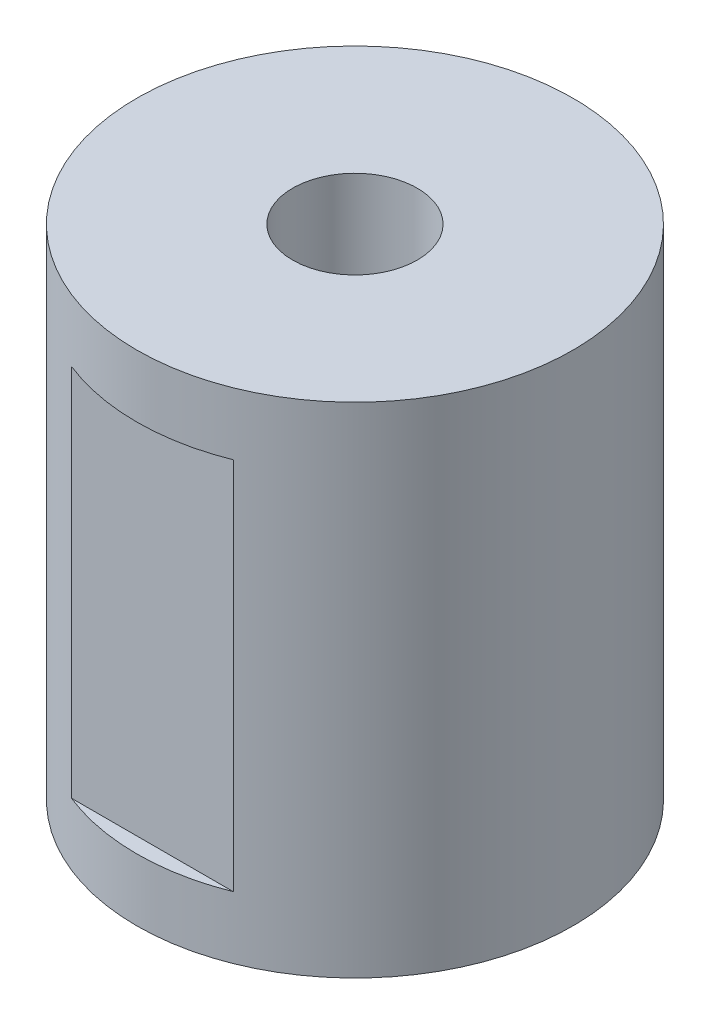
ISO-10303-21;
HEADER;
FILE_DESCRIPTION(('STEP AP214'),'2;1');
FILE_NAME('part.step','',(''),(''),'','','');
FILE_SCHEMA(('AUTOMOTIVE_DESIGN { 1 0 10303 214 1 1 1 1 }'));
ENDSEC;
DATA;
#1=APPLICATION_CONTEXT('core data for automotive mechanical design processes');
#2=APPLICATION_PROTOCOL_DEFINITION('international standard','automotive_design',2000,#1);
#3=PRODUCT_CONTEXT('',#1,'mechanical');
#4=PRODUCT('Part','Part','',(#3));
#5=PRODUCT_RELATED_PRODUCT_CATEGORY('part','',(#4));
#6=PRODUCT_DEFINITION_FORMATION('','',#4);
#7=PRODUCT_DEFINITION_CONTEXT('part definition',#1,'design');
#8=PRODUCT_DEFINITION('design','',#6,#7);
#9=PRODUCT_DEFINITION_SHAPE('','',#8);
#10=(LENGTH_UNIT() NAMED_UNIT(*) SI_UNIT(.MILLI.,.METRE.));
#11=(NAMED_UNIT(*) PLANE_ANGLE_UNIT() SI_UNIT($,.RADIAN.));
#12=(NAMED_UNIT(*) SI_UNIT($,.STERADIAN.) SOLID_ANGLE_UNIT());
#13=UNCERTAINTY_MEASURE_WITH_UNIT(LENGTH_MEASURE(1.E-05),#10,'distance_accuracy_value','');
#14=(GEOMETRIC_REPRESENTATION_CONTEXT(3) GLOBAL_UNCERTAINTY_ASSIGNED_CONTEXT((#13)) GLOBAL_UNIT_ASSIGNED_CONTEXT((#10,
#11,#12)) REPRESENTATION_CONTEXT('',''));
#15=CARTESIAN_POINT('',(0.,0.,0.));
#16=DIRECTION('',(0.,0.,1.));
#17=DIRECTION('',(1.,0.,0.));
#18=AXIS2_PLACEMENT_3D('',#15,#16,#17);
#19=CARTESIAN_POINT('',(0.,80000.,0.));
#20=DIRECTION('',(0.,-1.,0.));
#21=DIRECTION('',(0.,0.,-1.));
#22=AXIS2_PLACEMENT_3D('',#19,#20,#21);
#23=CYLINDRICAL_SURFACE('',#22,35000.);
#24=DIRECTION('',(0.,-1.,0.));
#25=VECTOR('',#24,1.);
#26=CARTESIAN_POINT('',(-30000.,80000.,-18027.7563773199));
#27=LINE('',#26,#25);
#28=CARTESIAN_POINT('',(-30000.,60000.,-18027.7563773199));
#29=VERTEX_POINT('',#28);
#30=CARTESIAN_POINT('',(-30000.,20000.,-18027.7563773199));
#31=VERTEX_POINT('',#30);
#32=EDGE_CURVE('E11',#29,#31,#27,.T.);
#33=ORIENTED_EDGE('',*,*,#32,.F.);
#34=CARTESIAN_POINT('',(0.,60000.,0.));
#35=DIRECTION('',(0.,1.,0.));
#36=DIRECTION('',(0.,0.,1.));
#37=AXIS2_PLACEMENT_3D('',#34,#35,#36);
#38=CIRCLE('',#37,35000.);
#39=CARTESIAN_POINT('',(-30000.,60000.,18027.75637732));
#40=VERTEX_POINT('',#39);
#41=EDGE_CURVE('E100',#29,#40,#38,.T.);
#42=ORIENTED_EDGE('',*,*,#41,.T.);
#43=DIRECTION('',(0.,-1.,0.));
#44=VECTOR('',#43,1.);
#45=CARTESIAN_POINT('',(-30000.,80000.,18027.7563773199));
#46=LINE('',#45,#44);
#47=CARTESIAN_POINT('',(-30000.,20000.,18027.7563773199));
#48=VERTEX_POINT('',#47);
#49=EDGE_CURVE('E47',#48,#40,#46,.F.);
#50=ORIENTED_EDGE('',*,*,#49,.F.);
#51=CARTESIAN_POINT('',(0.,20000.,0.));
#52=DIRECTION('',(0.,-1.,0.));
#53=DIRECTION('',(0.,0.,-1.));
#54=AXIS2_PLACEMENT_3D('',#51,#52,#53);
#55=CIRCLE('',#54,35000.);
#56=EDGE_CURVE('E53',#48,#31,#55,.T.);
#57=ORIENTED_EDGE('',*,*,#56,.T.);
#58=EDGE_LOOP('',(#33,#42,#50,#57));
#59=FACE_BOUND('',#58,.T.);
#60=CARTESIAN_POINT('',(0.,70000.,0.));
#61=DIRECTION('',(0.,1.,0.));
#62=DIRECTION('',(0.,0.,1.));
#63=AXIS2_PLACEMENT_3D('',#60,#61,#62);
#64=CIRCLE('',#63,35000.);
#65=CARTESIAN_POINT('',(-12990.,70000.,32500.1523073354));
#66=VERTEX_POINT('',#65);
#67=CARTESIAN_POINT('',(12990.,70000.,32500.1523073354));
#68=VERTEX_POINT('',#67);
#69=EDGE_CURVE('E120',#66,#68,#64,.T.);
#70=ORIENTED_EDGE('',*,*,#69,.T.);
#71=DIRECTION('',(0.,-1.,0.));
#72=VECTOR('',#71,1.);
#73=CARTESIAN_POINT('',(12990.,80000.,32500.1523073354));
#74=LINE('',#73,#72);
#75=CARTESIAN_POINT('',(12990.,10000.,32500.1523073354));
#76=VERTEX_POINT('',#75);
#77=EDGE_CURVE('E110',#68,#76,#74,.T.);
#78=ORIENTED_EDGE('',*,*,#77,.T.);
#79=CARTESIAN_POINT('',(0.,10000.,0.));
#80=DIRECTION('',(0.,-1.,0.));
#81=DIRECTION('',(0.,0.,-1.));
#82=AXIS2_PLACEMENT_3D('',#79,#80,#81);
#83=CIRCLE('',#82,35000.);
#84=CARTESIAN_POINT('',(-12990.,10000.,32500.1523073354));
#85=VERTEX_POINT('',#84);
#86=EDGE_CURVE('E123',#76,#85,#83,.T.);
#87=ORIENTED_EDGE('',*,*,#86,.T.);
#88=DIRECTION('',(0.,-1.,0.));
#89=VECTOR('',#88,1.);
#90=CARTESIAN_POINT('',(-12990.,80000.,32500.1523073354));
#91=LINE('',#90,#89);
#92=EDGE_CURVE('E116',#85,#66,#91,.F.);
#93=ORIENTED_EDGE('',*,*,#92,.T.);
#94=EDGE_LOOP('',(#70,#78,#87,#93));
#95=FACE_BOUND('',#94,.T.);
#96=CARTESIAN_POINT('',(0.,80000.,0.));
#97=DIRECTION('',(0.,1.,0.));
#98=DIRECTION('',(0.,0.,1.));
#99=AXIS2_PLACEMENT_3D('',#96,#97,#98);
#100=CIRCLE('',#99,35000.);
#101=CARTESIAN_POINT('',(0.,80000.,35000.));
#102=VERTEX_POINT('',#101);
#103=EDGE_CURVE('E127',#102,#102,#100,.T.);
#104=ORIENTED_EDGE('',*,*,#103,.F.);
#105=EDGE_LOOP('',(#104));
#106=FACE_BOUND('',#105,.T.);
#107=CARTESIAN_POINT('',(0.,0.,0.));
#108=DIRECTION('',(0.,1.,0.));
#109=DIRECTION('',(0.,0.,1.));
#110=AXIS2_PLACEMENT_3D('',#107,#108,#109);
#111=CIRCLE('',#110,35000.);
#112=CARTESIAN_POINT('',(0.,0.,35000.));
#113=VERTEX_POINT('',#112);
#114=EDGE_CURVE('E128',#113,#113,#111,.T.);
#115=ORIENTED_EDGE('',*,*,#114,.T.);
#116=EDGE_LOOP('',(#115));
#117=FACE_BOUND('',#116,.T.);
#118=ADVANCED_FACE('F39',(#59,#95,#106,#117),#23,.T.);
#119=CARTESIAN_POINT('',(0.,80000.,0.));
#120=DIRECTION('',(0.,1.,0.));
#121=DIRECTION('',(0.,0.,1.));
#122=AXIS2_PLACEMENT_3D('',#119,#120,#121);
#123=PLANE('',#122);
#124=CARTESIAN_POINT('',(0.,80000.,0.));
#125=DIRECTION('',(0.,1.,0.));
#126=DIRECTION('',(0.,0.,1.));
#127=AXIS2_PLACEMENT_3D('',#124,#125,#126);
#128=CIRCLE('',#127,10000.);
#129=CARTESIAN_POINT('',(0.,80000.,10000.));
#130=VERTEX_POINT('',#129);
#131=EDGE_CURVE('E136',#130,#130,#128,.T.);
#132=ORIENTED_EDGE('',*,*,#131,.F.);
#133=EDGE_LOOP('',(#132));
#134=FACE_BOUND('',#133,.T.);
#135=ORIENTED_EDGE('',*,*,#103,.T.);
#136=EDGE_LOOP('',(#135));
#137=FACE_BOUND('',#136,.T.);
#138=ADVANCED_FACE('F188',(#134,#137),#123,.T.);
#139=CARTESIAN_POINT('',(0.,0.,0.));
#140=DIRECTION('',(0.,1.,0.));
#141=DIRECTION('',(0.,0.,1.));
#142=AXIS2_PLACEMENT_3D('',#139,#140,#141);
#143=PLANE('',#142);
#144=CARTESIAN_POINT('',(0.,0.,0.));
#145=DIRECTION('',(0.,1.,0.));
#146=DIRECTION('',(0.,0.,1.));
#147=AXIS2_PLACEMENT_3D('',#144,#145,#146);
#148=CIRCLE('',#147,10000.);
#149=CARTESIAN_POINT('',(0.,0.,10000.));
#150=VERTEX_POINT('',#149);
#151=EDGE_CURVE('E132',#150,#150,#148,.T.);
#152=ORIENTED_EDGE('',*,*,#151,.T.);
#153=EDGE_LOOP('',(#152));
#154=FACE_BOUND('',#153,.T.);
#155=ORIENTED_EDGE('',*,*,#114,.F.);
#156=EDGE_LOOP('',(#155));
#157=FACE_BOUND('',#156,.T.);
#158=ADVANCED_FACE('F193',(#154,#157),#143,.F.);
#159=CARTESIAN_POINT('',(0.,0.,0.));
#160=DIRECTION('',(0.,1.,0.));
#161=DIRECTION('',(0.,0.,1.));
#162=AXIS2_PLACEMENT_3D('',#159,#160,#161);
#163=CYLINDRICAL_SURFACE('',#162,10000.);
#164=ORIENTED_EDGE('',*,*,#151,.F.);
#165=EDGE_LOOP('',(#164));
#166=FACE_BOUND('',#165,.T.);
#167=ORIENTED_EDGE('',*,*,#131,.T.);
#168=EDGE_LOOP('',(#167));
#169=FACE_BOUND('',#168,.T.);
#170=ADVANCED_FACE('F195',(#166,#169),#163,.F.);
#171=CARTESIAN_POINT('',(-12990.,70000.,32500.));
#172=DIRECTION('',(-1.,0.,0.));
#173=DIRECTION('',(0.,-1.,0.));
#174=AXIS2_PLACEMENT_3D('',#171,#172,#173);
#175=PLANE('',#174);
#176=DIRECTION('',(0.,0.,1.));
#177=VECTOR('',#176,1.);
#178=CARTESIAN_POINT('',(-12990.,10000.,32500.));
#179=LINE('',#178,#177);
#180=CARTESIAN_POINT('',(-12990.,10000.,32500.));
#181=VERTEX_POINT('',#180);
#182=EDGE_CURVE('E61',#181,#85,#179,.T.);
#183=ORIENTED_EDGE('',*,*,#182,.F.);
#184=DIRECTION('',(0.,-1.,0.));
#185=VECTOR('',#184,1.);
#186=CARTESIAN_POINT('',(-12990.,70000.,32500.));
#187=LINE('',#186,#185);
#188=CARTESIAN_POINT('',(-12990.,70000.,32500.));
#189=VERTEX_POINT('',#188);
#190=EDGE_CURVE('E104',#189,#181,#187,.T.);
#191=ORIENTED_EDGE('',*,*,#190,.F.);
#192=DIRECTION('',(0.,0.,1.));
#193=VECTOR('',#192,1.);
#194=CARTESIAN_POINT('',(-12990.,70000.,32500.));
#195=LINE('',#194,#193);
#196=EDGE_CURVE('E140',#189,#66,#195,.T.);
#197=ORIENTED_EDGE('',*,*,#196,.T.);
#198=ORIENTED_EDGE('',*,*,#92,.F.);
#199=EDGE_LOOP('',(#183,#191,#197,#198));
#200=FACE_BOUND('',#199,.T.);
#201=ADVANCED_FACE('F178',(#200),#175,.F.);
#202=CARTESIAN_POINT('',(-12990.,70000.,32500.));
#203=DIRECTION('',(0.,1.,0.));
#204=DIRECTION('',(0.,0.,1.));
#205=AXIS2_PLACEMENT_3D('',#202,#203,#204);
#206=PLANE('',#205);
#207=ORIENTED_EDGE('',*,*,#69,.F.);
#208=ORIENTED_EDGE('',*,*,#196,.F.);
#209=DIRECTION('',(-1.,0.,0.));
#210=VECTOR('',#209,1.);
#211=CARTESIAN_POINT('',(-12990.,70000.,32500.));
#212=LINE('',#211,#210);
#213=CARTESIAN_POINT('',(12990.,70000.,32500.));
#214=VERTEX_POINT('',#213);
#215=EDGE_CURVE('E147',#214,#189,#212,.T.);
#216=ORIENTED_EDGE('',*,*,#215,.F.);
#217=DIRECTION('',(0.,0.,1.));
#218=VECTOR('',#217,1.);
#219=CARTESIAN_POINT('',(12990.,70000.,32500.));
#220=LINE('',#219,#218);
#221=EDGE_CURVE('E151',#214,#68,#220,.T.);
#222=ORIENTED_EDGE('',*,*,#221,.T.);
#223=EDGE_LOOP('',(#207,#208,#216,#222));
#224=FACE_BOUND('',#223,.T.);
#225=ADVANCED_FACE('F185',(#224),#206,.F.);
#226=CARTESIAN_POINT('',(12990.,70000.,32500.));
#227=DIRECTION('',(1.,0.,0.));
#228=DIRECTION('',(0.,1.,0.));
#229=AXIS2_PLACEMENT_3D('',#226,#227,#228);
#230=PLANE('',#229);
#231=ORIENTED_EDGE('',*,*,#221,.F.);
#232=DIRECTION('',(0.,1.,0.));
#233=VECTOR('',#232,1.);
#234=CARTESIAN_POINT('',(12990.,70000.,32500.));
#235=LINE('',#234,#233);
#236=CARTESIAN_POINT('',(12990.,10000.,32500.));
#237=VERTEX_POINT('',#236);
#238=EDGE_CURVE('E161',#237,#214,#235,.T.);
#239=ORIENTED_EDGE('',*,*,#238,.F.);
#240=DIRECTION('',(0.,0.,1.));
#241=VECTOR('',#240,1.);
#242=CARTESIAN_POINT('',(12990.,10000.,32500.));
#243=LINE('',#242,#241);
#244=EDGE_CURVE('E146',#237,#76,#243,.T.);
#245=ORIENTED_EDGE('',*,*,#244,.T.);
#246=ORIENTED_EDGE('',*,*,#77,.F.);
#247=EDGE_LOOP('',(#231,#239,#245,#246));
#248=FACE_BOUND('',#247,.T.);
#249=ADVANCED_FACE('F183',(#248),#230,.F.);
#250=CARTESIAN_POINT('',(-12990.,10000.,32500.));
#251=DIRECTION('',(0.,-1.,0.));
#252=DIRECTION('',(0.,0.,-1.));
#253=AXIS2_PLACEMENT_3D('',#250,#251,#252);
#254=PLANE('',#253);
#255=ORIENTED_EDGE('',*,*,#244,.F.);
#256=DIRECTION('',(1.,0.,0.));
#257=VECTOR('',#256,1.);
#258=CARTESIAN_POINT('',(-12990.,10000.,32500.));
#259=LINE('',#258,#257);
#260=EDGE_CURVE('E165',#181,#237,#259,.T.);
#261=ORIENTED_EDGE('',*,*,#260,.F.);
#262=ORIENTED_EDGE('',*,*,#182,.T.);
#263=ORIENTED_EDGE('',*,*,#86,.F.);
#264=EDGE_LOOP('',(#255,#261,#262,#263));
#265=FACE_BOUND('',#264,.T.);
#266=ADVANCED_FACE('F179',(#265),#254,.F.);
#267=CARTESIAN_POINT('',(0.,0.,32500.));
#268=DIRECTION('',(0.,0.,1.));
#269=DIRECTION('',(1.,0.,0.));
#270=AXIS2_PLACEMENT_3D('',#267,#268,#269);
#271=PLANE('',#270);
#272=ORIENTED_EDGE('',*,*,#190,.T.);
#273=ORIENTED_EDGE('',*,*,#260,.T.);
#274=ORIENTED_EDGE('',*,*,#238,.T.);
#275=ORIENTED_EDGE('',*,*,#215,.T.);
#276=EDGE_LOOP('',(#272,#273,#274,#275));
#277=FACE_BOUND('',#276,.T.);
#278=ADVANCED_FACE('F175',(#277),#271,.T.);
#279=CARTESIAN_POINT('',(-30000.,60000.,-18030.));
#280=DIRECTION('',(0.,1.,0.));
#281=DIRECTION('',(0.,0.,1.));
#282=AXIS2_PLACEMENT_3D('',#279,#280,#281);
#283=PLANE('',#282);
#284=DIRECTION('',(0.,0.,-1.));
#285=VECTOR('',#284,1.);
#286=CARTESIAN_POINT('',(-30000.,60000.,-18030.));
#287=LINE('',#286,#285);
#288=EDGE_CURVE('E94',#40,#29,#287,.T.);
#289=ORIENTED_EDGE('',*,*,#288,.F.);
#290=ORIENTED_EDGE('',*,*,#41,.F.);
#291=EDGE_LOOP('',(#289,#290));
#292=FACE_BOUND('',#291,.T.);
#293=ADVANCED_FACE('F102',(#292),#283,.F.);
#294=CARTESIAN_POINT('',(-30000.,20000.,-18030.));
#295=DIRECTION('',(0.,-1.,0.));
#296=DIRECTION('',(0.,0.,-1.));
#297=AXIS2_PLACEMENT_3D('',#294,#295,#296);
#298=PLANE('',#297);
#299=DIRECTION('',(0.,0.,1.));
#300=VECTOR('',#299,1.);
#301=CARTESIAN_POINT('',(-30000.,20000.,-18030.));
#302=LINE('',#301,#300);
#303=EDGE_CURVE('E96',#31,#48,#302,.T.);
#304=ORIENTED_EDGE('',*,*,#303,.F.);
#305=ORIENTED_EDGE('',*,*,#56,.F.);
#306=EDGE_LOOP('',(#304,#305));
#307=FACE_BOUND('',#306,.T.);
#308=ADVANCED_FACE('F216',(#307),#298,.F.);
#309=CARTESIAN_POINT('',(-30000.,0.,0.));
#310=DIRECTION('',(-1.,0.,0.));
#311=DIRECTION('',(0.,0.,1.));
#312=AXIS2_PLACEMENT_3D('',#309,#310,#311);
#313=PLANE('',#312);
#314=ORIENTED_EDGE('',*,*,#32,.T.);
#315=ORIENTED_EDGE('',*,*,#303,.T.);
#316=ORIENTED_EDGE('',*,*,#49,.T.);
#317=ORIENTED_EDGE('',*,*,#288,.T.);
#318=EDGE_LOOP('',(#314,#315,#316,#317));
#319=FACE_BOUND('',#318,.T.);
#320=ADVANCED_FACE('F93',(#319),#313,.T.);
#321=CLOSED_SHELL('',(#118,#138,#158,#170,#201,#225,#249,#266,#278,#293,#308,#320));
#322=MANIFOLD_SOLID_BREP('B2',#321);
#323=ADVANCED_BREP_SHAPE_REPRESENTATION('',(#18,#322),#14);
#324=SHAPE_DEFINITION_REPRESENTATION(#9,#323);
ENDSEC;
END-ISO-10303-21;
